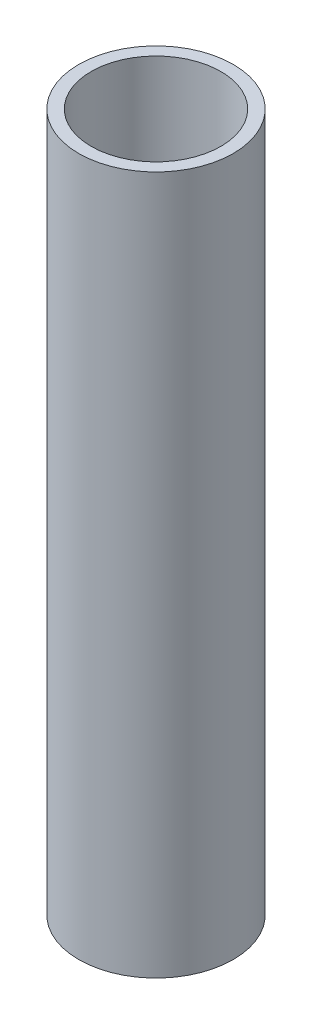
ISO-10303-21;
HEADER;
FILE_DESCRIPTION(('STEP AP214'),'2;1');
FILE_NAME('part.step','',(''),(''),'','','');
FILE_SCHEMA(('AUTOMOTIVE_DESIGN { 1 0 10303 214 1 1 1 1 }'));
ENDSEC;
DATA;
#1=APPLICATION_CONTEXT('core data for automotive mechanical design processes');
#2=APPLICATION_PROTOCOL_DEFINITION('international standard','automotive_design',2000,#1);
#3=PRODUCT_CONTEXT('',#1,'mechanical');
#4=PRODUCT('Part','Part','',(#3));
#5=PRODUCT_RELATED_PRODUCT_CATEGORY('part','',(#4));
#6=PRODUCT_DEFINITION_FORMATION('','',#4);
#7=PRODUCT_DEFINITION_CONTEXT('part definition',#1,'design');
#8=PRODUCT_DEFINITION('design','',#6,#7);
#9=PRODUCT_DEFINITION_SHAPE('','',#8);
#10=(LENGTH_UNIT() NAMED_UNIT(*) SI_UNIT(.MILLI.,.METRE.));
#11=(NAMED_UNIT(*) PLANE_ANGLE_UNIT() SI_UNIT($,.RADIAN.));
#12=(NAMED_UNIT(*) SI_UNIT($,.STERADIAN.) SOLID_ANGLE_UNIT());
#13=UNCERTAINTY_MEASURE_WITH_UNIT(LENGTH_MEASURE(1.E-05),#10,'distance_accuracy_value','');
#14=(GEOMETRIC_REPRESENTATION_CONTEXT(3) GLOBAL_UNCERTAINTY_ASSIGNED_CONTEXT((#13)) GLOBAL_UNIT_ASSIGNED_CONTEXT((#10,
#11,#12)) REPRESENTATION_CONTEXT('',''));
#15=CARTESIAN_POINT('',(0.,0.,0.));
#16=DIRECTION('',(0.,0.,1.));
#17=DIRECTION('',(1.,0.,0.));
#18=AXIS2_PLACEMENT_3D('',#15,#16,#17);
#19=CARTESIAN_POINT('',(0.,113.,0.));
#20=DIRECTION('',(0.,1.,0.));
#21=DIRECTION('',(0.,0.,1.));
#22=AXIS2_PLACEMENT_3D('',#19,#20,#21);
#23=PLANE('',#22);
#24=CARTESIAN_POINT('',(0.,113.,0.));
#25=DIRECTION('',(0.,1.,0.));
#26=DIRECTION('',(0.,0.,1.));
#27=AXIS2_PLACEMENT_3D('',#24,#25,#26);
#28=CIRCLE('',#27,12.500000019);
#29=CARTESIAN_POINT('',(0.,113.,12.500000019));
#30=VERTEX_POINT('',#29);
#31=EDGE_CURVE('E10',#30,#30,#28,.T.);
#32=ORIENTED_EDGE('',*,*,#31,.T.);
#33=EDGE_LOOP('',(#32));
#34=FACE_BOUND('',#33,.T.);
#35=CARTESIAN_POINT('',(0.,113.,0.));
#36=DIRECTION('',(0.,1.,0.));
#37=DIRECTION('',(0.,0.,1.));
#38=AXIS2_PLACEMENT_3D('',#35,#36,#37);
#39=CIRCLE('',#38,10.499999955);
#40=CARTESIAN_POINT('',(0.,113.,10.499999955));
#41=VERTEX_POINT('',#40);
#42=EDGE_CURVE('E47',#41,#41,#39,.T.);
#43=ORIENTED_EDGE('',*,*,#42,.F.);
#44=EDGE_LOOP('',(#43));
#45=FACE_BOUND('',#44,.T.);
#46=ADVANCED_FACE('F36',(#34,#45),#23,.T.);
#47=CARTESIAN_POINT('',(0.,0.,0.));
#48=DIRECTION('',(0.,1.,0.));
#49=DIRECTION('',(0.,0.,1.));
#50=AXIS2_PLACEMENT_3D('',#47,#48,#49);
#51=PLANE('',#50);
#52=CARTESIAN_POINT('',(0.,0.,0.));
#53=DIRECTION('',(0.,1.,0.));
#54=DIRECTION('',(0.,0.,1.));
#55=AXIS2_PLACEMENT_3D('',#52,#53,#54);
#56=CIRCLE('',#55,12.500000019);
#57=CARTESIAN_POINT('',(0.,0.,12.500000019));
#58=VERTEX_POINT('',#57);
#59=EDGE_CURVE('E40',#58,#58,#56,.T.);
#60=ORIENTED_EDGE('',*,*,#59,.F.);
#61=EDGE_LOOP('',(#60));
#62=FACE_BOUND('',#61,.T.);
#63=CARTESIAN_POINT('',(0.,0.,0.));
#64=DIRECTION('',(0.,1.,0.));
#65=DIRECTION('',(0.,0.,1.));
#66=AXIS2_PLACEMENT_3D('',#63,#64,#65);
#67=CIRCLE('',#66,10.499999955);
#68=CARTESIAN_POINT('',(0.,0.,10.499999955));
#69=VERTEX_POINT('',#68);
#70=EDGE_CURVE('E49',#69,#69,#67,.T.);
#71=ORIENTED_EDGE('',*,*,#70,.T.);
#72=EDGE_LOOP('',(#71));
#73=FACE_BOUND('',#72,.T.);
#74=ADVANCED_FACE('F59',(#62,#73),#51,.F.);
#75=CARTESIAN_POINT('',(0.,113.,0.));
#76=DIRECTION('',(0.,-1.,0.));
#77=DIRECTION('',(0.,0.,-1.));
#78=AXIS2_PLACEMENT_3D('',#75,#76,#77);
#79=CYLINDRICAL_SURFACE('',#78,12.500000019);
#80=ORIENTED_EDGE('',*,*,#31,.F.);
#81=EDGE_LOOP('',(#80));
#82=FACE_BOUND('',#81,.T.);
#83=ORIENTED_EDGE('',*,*,#59,.T.);
#84=EDGE_LOOP('',(#83));
#85=FACE_BOUND('',#84,.T.);
#86=ADVANCED_FACE('F38',(#82,#85),#79,.T.);
#87=CARTESIAN_POINT('',(0.,113.,0.));
#88=DIRECTION('',(0.,-1.,0.));
#89=DIRECTION('',(0.,0.,-1.));
#90=AXIS2_PLACEMENT_3D('',#87,#88,#89);
#91=CYLINDRICAL_SURFACE('',#90,10.499999955);
#92=ORIENTED_EDGE('',*,*,#42,.T.);
#93=EDGE_LOOP('',(#92));
#94=FACE_BOUND('',#93,.T.);
#95=ORIENTED_EDGE('',*,*,#70,.F.);
#96=EDGE_LOOP('',(#95));
#97=FACE_BOUND('',#96,.T.);
#98=ADVANCED_FACE('F55',(#94,#97),#91,.F.);
#99=CLOSED_SHELL('',(#46,#74,#86,#98));
#100=MANIFOLD_SOLID_BREP('B2',#99);
#101=ADVANCED_BREP_SHAPE_REPRESENTATION('',(#18,#100),#14);
#102=SHAPE_DEFINITION_REPRESENTATION(#9,#101);
ENDSEC;
END-ISO-10303-21;
